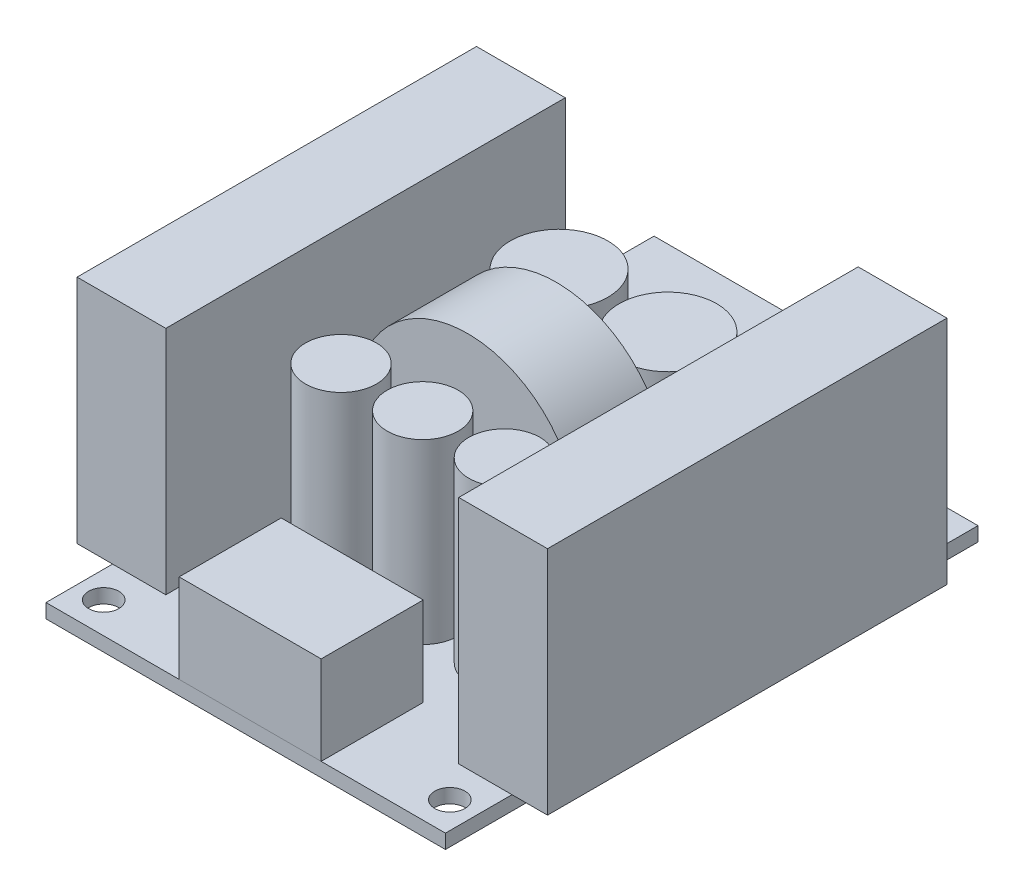
ISO-10303-21;
HEADER;
FILE_DESCRIPTION(('STEP AP214'),'2;1');
FILE_NAME('part.step','',(''),(''),'','','');
FILE_SCHEMA(('AUTOMOTIVE_DESIGN { 1 0 10303 214 1 1 1 1 }'));
ENDSEC;
DATA;
#1=APPLICATION_CONTEXT('core data for automotive mechanical design processes');
#2=APPLICATION_PROTOCOL_DEFINITION('international standard','automotive_design',2000,#1);
#3=PRODUCT_CONTEXT('',#1,'mechanical');
#4=PRODUCT('Part','Part','',(#3));
#5=PRODUCT_RELATED_PRODUCT_CATEGORY('part','',(#4));
#6=PRODUCT_DEFINITION_FORMATION('','',#4);
#7=PRODUCT_DEFINITION_CONTEXT('part definition',#1,'design');
#8=PRODUCT_DEFINITION('design','',#6,#7);
#9=PRODUCT_DEFINITION_SHAPE('','',#8);
#10=(LENGTH_UNIT() NAMED_UNIT(*) SI_UNIT(.MILLI.,.METRE.));
#11=(NAMED_UNIT(*) PLANE_ANGLE_UNIT() SI_UNIT($,.RADIAN.));
#12=(NAMED_UNIT(*) SI_UNIT($,.STERADIAN.) SOLID_ANGLE_UNIT());
#13=UNCERTAINTY_MEASURE_WITH_UNIT(LENGTH_MEASURE(1.E-05),#10,'distance_accuracy_value','');
#14=(GEOMETRIC_REPRESENTATION_CONTEXT(3) GLOBAL_UNCERTAINTY_ASSIGNED_CONTEXT((#13)) GLOBAL_UNIT_ASSIGNED_CONTEXT((#10,
#11,#12)) REPRESENTATION_CONTEXT('',''));
#15=CARTESIAN_POINT('',(0.,0.,0.));
#16=DIRECTION('',(0.,0.,1.));
#17=DIRECTION('',(1.,0.,0.));
#18=AXIS2_PLACEMENT_3D('',#15,#16,#17);
#19=CARTESIAN_POINT('',(9.20490239777416,21.6,10.061105761081));
#20=DIRECTION('',(0.,-1.,0.));
#21=DIRECTION('',(0.,0.,-1.));
#22=AXIS2_PLACEMENT_3D('',#19,#20,#21);
#23=CYLINDRICAL_SURFACE('',#22,4.00000000000001);
#24=CARTESIAN_POINT('',(9.20490239777416,21.6,10.061105761081));
#25=DIRECTION('',(0.,1.,0.));
#26=DIRECTION('',(0.,0.,-1.));
#27=AXIS2_PLACEMENT_3D('',#24,#25,#26);
#28=CIRCLE('',#27,4.00000000000001);
#29=CARTESIAN_POINT('',(9.20490239777416,21.6,6.06110576108103));
#30=VERTEX_POINT('',#29);
#31=EDGE_CURVE('E11',#30,#30,#28,.T.);
#32=ORIENTED_EDGE('',*,*,#31,.F.);
#33=EDGE_LOOP('',(#32));
#34=FACE_BOUND('',#33,.T.);
#35=CARTESIAN_POINT('',(9.20490239777416,1.6,10.061105761081));
#36=DIRECTION('',(0.,1.,0.));
#37=DIRECTION('',(0.,0.,-1.));
#38=AXIS2_PLACEMENT_3D('',#35,#36,#37);
#39=CIRCLE('',#38,4.00000000000001);
#40=CARTESIAN_POINT('',(9.20490239777416,1.6,6.06110576108103));
#41=VERTEX_POINT('',#40);
#42=EDGE_CURVE('E42',#41,#41,#39,.T.);
#43=ORIENTED_EDGE('',*,*,#42,.T.);
#44=EDGE_LOOP('',(#43));
#45=FACE_BOUND('',#44,.T.);
#46=ADVANCED_FACE('F39',(#34,#45),#23,.T.);
#47=CARTESIAN_POINT('',(9.20490239777416,21.6,10.061105761081));
#48=DIRECTION('',(0.,-1.,0.));
#49=DIRECTION('',(0.,0.,-1.));
#50=AXIS2_PLACEMENT_3D('',#47,#48,#49);
#51=PLANE('',#50);
#52=ORIENTED_EDGE('',*,*,#31,.T.);
#53=EDGE_LOOP('',(#52));
#54=FACE_BOUND('',#53,.T.);
#55=ADVANCED_FACE('F54',(#54),#51,.F.);
#56=CARTESIAN_POINT('',(9.20490239777416,1.6,10.061105761081));
#57=DIRECTION('',(0.,-1.,0.));
#58=DIRECTION('',(0.,0.,-1.));
#59=AXIS2_PLACEMENT_3D('',#56,#57,#58);
#60=PLANE('',#59);
#61=ORIENTED_EDGE('',*,*,#42,.F.);
#62=EDGE_LOOP('',(#61));
#63=FACE_BOUND('',#62,.T.);
#64=ADVANCED_FACE('F52',(#63),#60,.T.);
#65=CLOSED_SHELL('',(#46,#55,#64));
#66=MANIFOLD_SOLID_BREP('B2',#65);
#67=CARTESIAN_POINT('',(-9.20490239777416,21.6,10.061105761081));
#68=DIRECTION('',(0.,-1.,0.));
#69=DIRECTION('',(0.,0.,-1.));
#70=AXIS2_PLACEMENT_3D('',#67,#68,#69);
#71=CYLINDRICAL_SURFACE('',#70,4.);
#72=CARTESIAN_POINT('',(-9.20490239777416,21.6,10.061105761081));
#73=DIRECTION('',(0.,1.,0.));
#74=DIRECTION('',(0.,0.,1.));
#75=AXIS2_PLACEMENT_3D('',#72,#73,#74);
#76=CIRCLE('',#75,4.);
#77=CARTESIAN_POINT('',(-9.20490239777416,21.6,14.061105761081));
#78=VERTEX_POINT('',#77);
#79=EDGE_CURVE('E38',#78,#78,#76,.T.);
#80=ORIENTED_EDGE('',*,*,#79,.F.);
#81=EDGE_LOOP('',(#80));
#82=FACE_BOUND('',#81,.T.);
#83=CARTESIAN_POINT('',(-9.20490239777416,1.6,10.061105761081));
#84=DIRECTION('',(0.,1.,0.));
#85=DIRECTION('',(0.,0.,1.));
#86=AXIS2_PLACEMENT_3D('',#83,#84,#85);
#87=CIRCLE('',#86,4.);
#88=CARTESIAN_POINT('',(-9.20490239777416,1.6,14.061105761081));
#89=VERTEX_POINT('',#88);
#90=EDGE_CURVE('E90',#89,#89,#87,.T.);
#91=ORIENTED_EDGE('',*,*,#90,.T.);
#92=EDGE_LOOP('',(#91));
#93=FACE_BOUND('',#92,.T.);
#94=ADVANCED_FACE('F87',(#82,#93),#71,.T.);
#95=CARTESIAN_POINT('',(-9.20490239777416,21.6,10.061105761081));
#96=DIRECTION('',(0.,1.,0.));
#97=DIRECTION('',(0.,0.,1.));
#98=AXIS2_PLACEMENT_3D('',#95,#96,#97);
#99=PLANE('',#98);
#100=ORIENTED_EDGE('',*,*,#79,.T.);
#101=EDGE_LOOP('',(#100));
#102=FACE_BOUND('',#101,.T.);
#103=ADVANCED_FACE('F102',(#102),#99,.T.);
#104=CARTESIAN_POINT('',(-9.20490239777416,1.6,10.061105761081));
#105=DIRECTION('',(0.,1.,0.));
#106=DIRECTION('',(0.,0.,1.));
#107=AXIS2_PLACEMENT_3D('',#104,#105,#106);
#108=PLANE('',#107);
#109=ORIENTED_EDGE('',*,*,#90,.F.);
#110=EDGE_LOOP('',(#109));
#111=FACE_BOUND('',#110,.T.);
#112=ADVANCED_FACE('F100',(#111),#108,.F.);
#113=CLOSED_SHELL('',(#94,#103,#112));
#114=MANIFOLD_SOLID_BREP('B6',#113);
#115=CARTESIAN_POINT('',(0.,21.6,10.061105761081));
#116=DIRECTION('',(0.,-1.,0.));
#117=DIRECTION('',(0.,0.,-1.));
#118=AXIS2_PLACEMENT_3D('',#115,#116,#117);
#119=CYLINDRICAL_SURFACE('',#118,4.);
#120=CARTESIAN_POINT('',(0.,21.6,10.061105761081));
#121=DIRECTION('',(0.,1.,0.));
#122=DIRECTION('',(0.,0.,1.));
#123=AXIS2_PLACEMENT_3D('',#120,#121,#122);
#124=CIRCLE('',#123,4.);
#125=CARTESIAN_POINT('',(0.,21.6,14.061105761081));
#126=VERTEX_POINT('',#125);
#127=EDGE_CURVE('E86',#126,#126,#124,.T.);
#128=ORIENTED_EDGE('',*,*,#127,.F.);
#129=EDGE_LOOP('',(#128));
#130=FACE_BOUND('',#129,.T.);
#131=CARTESIAN_POINT('',(0.,1.6,10.061105761081));
#132=DIRECTION('',(0.,1.,0.));
#133=DIRECTION('',(0.,0.,1.));
#134=AXIS2_PLACEMENT_3D('',#131,#132,#133);
#135=CIRCLE('',#134,4.);
#136=CARTESIAN_POINT('',(0.,1.6,14.061105761081));
#137=VERTEX_POINT('',#136);
#138=EDGE_CURVE('E138',#137,#137,#135,.T.);
#139=ORIENTED_EDGE('',*,*,#138,.T.);
#140=EDGE_LOOP('',(#139));
#141=FACE_BOUND('',#140,.T.);
#142=ADVANCED_FACE('F135',(#130,#141),#119,.T.);
#143=CARTESIAN_POINT('',(0.,21.6,10.061105761081));
#144=DIRECTION('',(0.,1.,0.));
#145=DIRECTION('',(0.,0.,1.));
#146=AXIS2_PLACEMENT_3D('',#143,#144,#145);
#147=PLANE('',#146);
#148=ORIENTED_EDGE('',*,*,#127,.T.);
#149=EDGE_LOOP('',(#148));
#150=FACE_BOUND('',#149,.T.);
#151=ADVANCED_FACE('F150',(#150),#147,.T.);
#152=CARTESIAN_POINT('',(0.,1.6,10.061105761081));
#153=DIRECTION('',(0.,1.,0.));
#154=DIRECTION('',(0.,0.,1.));
#155=AXIS2_PLACEMENT_3D('',#152,#153,#154);
#156=PLANE('',#155);
#157=ORIENTED_EDGE('',*,*,#138,.F.);
#158=EDGE_LOOP('',(#157));
#159=FACE_BOUND('',#158,.T.);
#160=ADVANCED_FACE('F148',(#159),#156,.F.);
#161=CLOSED_SHELL('',(#142,#151,#160));
#162=MANIFOLD_SOLID_BREP('B33',#161);
#163=CARTESIAN_POINT('',(6.13089759294121,21.6,-11.4334985532298));
#164=DIRECTION('',(0.,-1.,0.));
#165=DIRECTION('',(0.,0.,-1.));
#166=AXIS2_PLACEMENT_3D('',#163,#164,#165);
#167=CYLINDRICAL_SURFACE('',#166,5.5);
#168=CARTESIAN_POINT('',(6.13089759294121,21.6,-11.4334985532298));
#169=DIRECTION('',(0.,1.,0.));
#170=DIRECTION('',(0.,0.,-1.));
#171=AXIS2_PLACEMENT_3D('',#168,#169,#170);
#172=CIRCLE('',#171,5.5);
#173=CARTESIAN_POINT('',(6.13089759294121,21.6,-16.9334985532298));
#174=VERTEX_POINT('',#173);
#175=EDGE_CURVE('E134',#174,#174,#172,.T.);
#176=ORIENTED_EDGE('',*,*,#175,.F.);
#177=EDGE_LOOP('',(#176));
#178=FACE_BOUND('',#177,.T.);
#179=CARTESIAN_POINT('',(6.13089759294121,1.6,-11.4334985532298));
#180=DIRECTION('',(0.,1.,0.));
#181=DIRECTION('',(0.,0.,-1.));
#182=AXIS2_PLACEMENT_3D('',#179,#180,#181);
#183=CIRCLE('',#182,5.5);
#184=CARTESIAN_POINT('',(6.13089759294121,1.6,-16.9334985532298));
#185=VERTEX_POINT('',#184);
#186=EDGE_CURVE('E186',#185,#185,#183,.T.);
#187=ORIENTED_EDGE('',*,*,#186,.T.);
#188=EDGE_LOOP('',(#187));
#189=FACE_BOUND('',#188,.T.);
#190=ADVANCED_FACE('F183',(#178,#189),#167,.T.);
#191=CARTESIAN_POINT('',(6.13089759294121,21.6,-11.4334985532298));
#192=DIRECTION('',(0.,-1.,0.));
#193=DIRECTION('',(0.,0.,-1.));
#194=AXIS2_PLACEMENT_3D('',#191,#192,#193);
#195=PLANE('',#194);
#196=ORIENTED_EDGE('',*,*,#175,.T.);
#197=EDGE_LOOP('',(#196));
#198=FACE_BOUND('',#197,.T.);
#199=ADVANCED_FACE('F198',(#198),#195,.F.);
#200=CARTESIAN_POINT('',(6.13089759294121,1.6,-11.4334985532298));
#201=DIRECTION('',(0.,-1.,0.));
#202=DIRECTION('',(0.,0.,-1.));
#203=AXIS2_PLACEMENT_3D('',#200,#201,#202);
#204=PLANE('',#203);
#205=ORIENTED_EDGE('',*,*,#186,.F.);
#206=EDGE_LOOP('',(#205));
#207=FACE_BOUND('',#206,.T.);
#208=ADVANCED_FACE('F196',(#207),#204,.T.);
#209=CLOSED_SHELL('',(#190,#199,#208));
#210=MANIFOLD_SOLID_BREP('B81',#209);
#211=CARTESIAN_POINT('',(-6.13089759294121,21.6,-11.4334985532298));
#212=DIRECTION('',(0.,-1.,0.));
#213=DIRECTION('',(0.,0.,-1.));
#214=AXIS2_PLACEMENT_3D('',#211,#212,#213);
#215=CYLINDRICAL_SURFACE('',#214,5.5);
#216=CARTESIAN_POINT('',(-6.13089759294121,21.6,-11.4334985532298));
#217=DIRECTION('',(0.,1.,0.));
#218=DIRECTION('',(0.,0.,1.));
#219=AXIS2_PLACEMENT_3D('',#216,#217,#218);
#220=CIRCLE('',#219,5.5);
#221=CARTESIAN_POINT('',(-6.13089759294121,21.6,-5.93349855322976));
#222=VERTEX_POINT('',#221);
#223=EDGE_CURVE('E182',#222,#222,#220,.T.);
#224=ORIENTED_EDGE('',*,*,#223,.F.);
#225=EDGE_LOOP('',(#224));
#226=FACE_BOUND('',#225,.T.);
#227=CARTESIAN_POINT('',(-6.13089759294121,1.6,-11.4334985532298));
#228=DIRECTION('',(0.,1.,0.));
#229=DIRECTION('',(0.,0.,1.));
#230=AXIS2_PLACEMENT_3D('',#227,#228,#229);
#231=CIRCLE('',#230,5.5);
#232=CARTESIAN_POINT('',(-6.13089759294121,1.6,-5.93349855322976));
#233=VERTEX_POINT('',#232);
#234=EDGE_CURVE('E234',#233,#233,#231,.T.);
#235=ORIENTED_EDGE('',*,*,#234,.T.);
#236=EDGE_LOOP('',(#235));
#237=FACE_BOUND('',#236,.T.);
#238=ADVANCED_FACE('F231',(#226,#237),#215,.T.);
#239=CARTESIAN_POINT('',(-6.13089759294121,21.6,-11.4334985532298));
#240=DIRECTION('',(0.,1.,0.));
#241=DIRECTION('',(0.,0.,1.));
#242=AXIS2_PLACEMENT_3D('',#239,#240,#241);
#243=PLANE('',#242);
#244=ORIENTED_EDGE('',*,*,#223,.T.);
#245=EDGE_LOOP('',(#244));
#246=FACE_BOUND('',#245,.T.);
#247=ADVANCED_FACE('F246',(#246),#243,.T.);
#248=CARTESIAN_POINT('',(-6.13089759294121,1.6,-11.4334985532298));
#249=DIRECTION('',(0.,1.,0.));
#250=DIRECTION('',(0.,0.,1.));
#251=AXIS2_PLACEMENT_3D('',#248,#249,#250);
#252=PLANE('',#251);
#253=ORIENTED_EDGE('',*,*,#234,.F.);
#254=EDGE_LOOP('',(#253));
#255=FACE_BOUND('',#254,.T.);
#256=ADVANCED_FACE('F244',(#255),#252,.F.);
#257=CLOSED_SHELL('',(#238,#247,#256));
#258=MANIFOLD_SOLID_BREP('B129',#257);
#259=CARTESIAN_POINT('',(0.,14.1,5.));
#260=DIRECTION('',(0.,0.,-1.));
#261=DIRECTION('',(-1.,0.,0.));
#262=AXIS2_PLACEMENT_3D('',#259,#260,#261);
#263=CYLINDRICAL_SURFACE('',#262,12.5);
#264=CARTESIAN_POINT('',(0.,14.1,5.));
#265=DIRECTION('',(0.,0.,1.));
#266=DIRECTION('',(1.,0.,0.));
#267=AXIS2_PLACEMENT_3D('',#264,#265,#266);
#268=CIRCLE('',#267,12.5);
#269=CARTESIAN_POINT('',(12.5,14.1,5.));
#270=VERTEX_POINT('',#269);
#271=EDGE_CURVE('E230',#270,#270,#268,.T.);
#272=ORIENTED_EDGE('',*,*,#271,.F.);
#273=EDGE_LOOP('',(#272));
#274=FACE_BOUND('',#273,.T.);
#275=CARTESIAN_POINT('',(0.,14.1,-5.));
#276=DIRECTION('',(0.,0.,1.));
#277=DIRECTION('',(1.,0.,0.));
#278=AXIS2_PLACEMENT_3D('',#275,#276,#277);
#279=CIRCLE('',#278,12.5);
#280=CARTESIAN_POINT('',(12.5,14.1,-5.));
#281=VERTEX_POINT('',#280);
#282=EDGE_CURVE('E284',#281,#281,#279,.T.);
#283=ORIENTED_EDGE('',*,*,#282,.T.);
#284=EDGE_LOOP('',(#283));
#285=FACE_BOUND('',#284,.T.);
#286=ADVANCED_FACE('F281',(#274,#285),#263,.T.);
#287=CARTESIAN_POINT('',(0.,14.1,5.));
#288=DIRECTION('',(0.,0.,1.));
#289=DIRECTION('',(1.,0.,0.));
#290=AXIS2_PLACEMENT_3D('',#287,#288,#289);
#291=PLANE('',#290);
#292=ORIENTED_EDGE('',*,*,#271,.T.);
#293=EDGE_LOOP('',(#292));
#294=FACE_BOUND('',#293,.T.);
#295=ADVANCED_FACE('F296',(#294),#291,.T.);
#296=CARTESIAN_POINT('',(0.,14.1,-5.));
#297=DIRECTION('',(0.,0.,1.));
#298=DIRECTION('',(1.,0.,0.));
#299=AXIS2_PLACEMENT_3D('',#296,#297,#298);
#300=PLANE('',#299);
#301=ORIENTED_EDGE('',*,*,#282,.F.);
#302=EDGE_LOOP('',(#301));
#303=FACE_BOUND('',#302,.T.);
#304=ADVANCED_FACE('F294',(#303),#300,.F.);
#305=CLOSED_SHELL('',(#286,#295,#304));
#306=MANIFOLD_SOLID_BREP('B177',#305);
#307=CARTESIAN_POINT('',(-14.,11.6,-30.));
#308=DIRECTION('',(1.,0.,0.));
#309=DIRECTION('',(0.,0.,-1.));
#310=AXIS2_PLACEMENT_3D('',#307,#308,#309);
#311=PLANE('',#310);
#312=DIRECTION('',(0.,0.,1.));
#313=VECTOR('',#312,1.);
#314=CARTESIAN_POINT('',(-14.,1.6,-30.));
#315=LINE('',#314,#313);
#316=CARTESIAN_POINT('',(-14.,1.6,-30.));
#317=VERTEX_POINT('',#316);
#318=CARTESIAN_POINT('',(-14.,1.6,-18.5));
#319=VERTEX_POINT('',#318);
#320=EDGE_CURVE('E394',#317,#319,#315,.T.);
#321=ORIENTED_EDGE('',*,*,#320,.T.);
#322=DIRECTION('',(0.,-1.,0.));
#323=VECTOR('',#322,1.);
#324=CARTESIAN_POINT('',(-14.,11.6,-18.5));
#325=LINE('',#324,#323);
#326=CARTESIAN_POINT('',(-14.,11.6,-18.5));
#327=VERTEX_POINT('',#326);
#328=EDGE_CURVE('E279',#327,#319,#325,.T.);
#329=ORIENTED_EDGE('',*,*,#328,.F.);
#330=DIRECTION('',(0.,0.,1.));
#331=VECTOR('',#330,1.);
#332=CARTESIAN_POINT('',(-14.,11.6,-30.));
#333=LINE('',#332,#331);
#334=CARTESIAN_POINT('',(-14.,11.6,-30.));
#335=VERTEX_POINT('',#334);
#336=EDGE_CURVE('E382',#335,#327,#333,.T.);
#337=ORIENTED_EDGE('',*,*,#336,.F.);
#338=DIRECTION('',(0.,-1.,0.));
#339=VECTOR('',#338,1.);
#340=CARTESIAN_POINT('',(-14.,11.6,-30.));
#341=LINE('',#340,#339);
#342=EDGE_CURVE('E390',#335,#317,#341,.T.);
#343=ORIENTED_EDGE('',*,*,#342,.T.);
#344=EDGE_LOOP('',(#321,#329,#337,#343));
#345=FACE_BOUND('',#344,.T.);
#346=ADVANCED_FACE('F331',(#345),#311,.F.);
#347=CARTESIAN_POINT('',(-14.,11.6,-18.5));
#348=DIRECTION('',(0.,0.,-1.));
#349=DIRECTION('',(-1.,0.,0.));
#350=AXIS2_PLACEMENT_3D('',#347,#348,#349);
#351=PLANE('',#350);
#352=DIRECTION('',(1.,0.,0.));
#353=VECTOR('',#352,1.);
#354=CARTESIAN_POINT('',(-14.,1.6,-18.5));
#355=LINE('',#354,#353);
#356=CARTESIAN_POINT('',(2.,1.6,-18.5));
#357=VERTEX_POINT('',#356);
#358=EDGE_CURVE('E386',#319,#357,#355,.T.);
#359=ORIENTED_EDGE('',*,*,#358,.T.);
#360=DIRECTION('',(0.,-1.,0.));
#361=VECTOR('',#360,1.);
#362=CARTESIAN_POINT('',(2.,11.6,-18.5));
#363=LINE('',#362,#361);
#364=CARTESIAN_POINT('',(2.,11.6,-18.5));
#365=VERTEX_POINT('',#364);
#366=EDGE_CURVE('E339',#365,#357,#363,.T.);
#367=ORIENTED_EDGE('',*,*,#366,.F.);
#368=DIRECTION('',(1.,0.,0.));
#369=VECTOR('',#368,1.);
#370=CARTESIAN_POINT('',(-14.,11.6,-18.5));
#371=LINE('',#370,#369);
#372=EDGE_CURVE('E377',#327,#365,#371,.T.);
#373=ORIENTED_EDGE('',*,*,#372,.F.);
#374=ORIENTED_EDGE('',*,*,#328,.T.);
#375=EDGE_LOOP('',(#359,#367,#373,#374));
#376=FACE_BOUND('',#375,.T.);
#377=ADVANCED_FACE('F385',(#376),#351,.F.);
#378=CARTESIAN_POINT('',(2.,11.6,-30.));
#379=DIRECTION('',(-1.,0.,0.));
#380=DIRECTION('',(0.,0.,1.));
#381=AXIS2_PLACEMENT_3D('',#378,#379,#380);
#382=PLANE('',#381);
#383=DIRECTION('',(0.,0.,-1.));
#384=VECTOR('',#383,1.);
#385=CARTESIAN_POINT('',(2.,1.6,-30.));
#386=LINE('',#385,#384);
#387=CARTESIAN_POINT('',(2.,1.6,-30.));
#388=VERTEX_POINT('',#387);
#389=EDGE_CURVE('E364',#357,#388,#386,.T.);
#390=ORIENTED_EDGE('',*,*,#389,.T.);
#391=DIRECTION('',(0.,-1.,0.));
#392=VECTOR('',#391,1.);
#393=CARTESIAN_POINT('',(2.,11.6,-30.));
#394=LINE('',#393,#392);
#395=CARTESIAN_POINT('',(2.,11.6,-30.));
#396=VERTEX_POINT('',#395);
#397=EDGE_CURVE('E387',#396,#388,#394,.T.);
#398=ORIENTED_EDGE('',*,*,#397,.F.);
#399=DIRECTION('',(0.,0.,-1.));
#400=VECTOR('',#399,1.);
#401=CARTESIAN_POINT('',(2.,11.6,-30.));
#402=LINE('',#401,#400);
#403=EDGE_CURVE('E380',#365,#396,#402,.T.);
#404=ORIENTED_EDGE('',*,*,#403,.F.);
#405=ORIENTED_EDGE('',*,*,#366,.T.);
#406=EDGE_LOOP('',(#390,#398,#404,#405));
#407=FACE_BOUND('',#406,.T.);
#408=ADVANCED_FACE('F388',(#407),#382,.F.);
#409=CARTESIAN_POINT('',(-14.,11.6,-30.));
#410=DIRECTION('',(0.,0.,1.));
#411=DIRECTION('',(1.,0.,0.));
#412=AXIS2_PLACEMENT_3D('',#409,#410,#411);
#413=PLANE('',#412);
#414=DIRECTION('',(-1.,0.,0.));
#415=VECTOR('',#414,1.);
#416=CARTESIAN_POINT('',(-14.,1.6,-30.));
#417=LINE('',#416,#415);
#418=EDGE_CURVE('E370',#388,#317,#417,.T.);
#419=ORIENTED_EDGE('',*,*,#418,.T.);
#420=ORIENTED_EDGE('',*,*,#342,.F.);
#421=DIRECTION('',(-1.,0.,0.));
#422=VECTOR('',#421,1.);
#423=CARTESIAN_POINT('',(-14.,11.6,-30.));
#424=LINE('',#423,#422);
#425=EDGE_CURVE('E347',#396,#335,#424,.T.);
#426=ORIENTED_EDGE('',*,*,#425,.F.);
#427=ORIENTED_EDGE('',*,*,#397,.T.);
#428=EDGE_LOOP('',(#419,#420,#426,#427));
#429=FACE_BOUND('',#428,.T.);
#430=ADVANCED_FACE('F401',(#429),#413,.F.);
#431=CARTESIAN_POINT('',(0.,11.6,0.));
#432=DIRECTION('',(0.,1.,0.));
#433=DIRECTION('',(0.,0.,1.));
#434=AXIS2_PLACEMENT_3D('',#431,#432,#433);
#435=PLANE('',#434);
#436=ORIENTED_EDGE('',*,*,#336,.T.);
#437=ORIENTED_EDGE('',*,*,#372,.T.);
#438=ORIENTED_EDGE('',*,*,#403,.T.);
#439=ORIENTED_EDGE('',*,*,#425,.T.);
#440=EDGE_LOOP('',(#436,#437,#438,#439));
#441=FACE_BOUND('',#440,.T.);
#442=ADVANCED_FACE('F378',(#441),#435,.T.);
#443=CARTESIAN_POINT('',(0.,1.6,0.));
#444=DIRECTION('',(0.,1.,0.));
#445=DIRECTION('',(0.,0.,1.));
#446=AXIS2_PLACEMENT_3D('',#443,#444,#445);
#447=PLANE('',#446);
#448=ORIENTED_EDGE('',*,*,#320,.F.);
#449=ORIENTED_EDGE('',*,*,#418,.F.);
#450=ORIENTED_EDGE('',*,*,#389,.F.);
#451=ORIENTED_EDGE('',*,*,#358,.F.);
#452=EDGE_LOOP('',(#448,#449,#450,#451));
#453=FACE_BOUND('',#452,.T.);
#454=ADVANCED_FACE('F404',(#453),#447,.F.);
#455=CLOSED_SHELL('',(#346,#377,#408,#430,#442,#454));
#456=MANIFOLD_SOLID_BREP('B225',#455);
#457=CARTESIAN_POINT('',(8.5,11.6,30.));
#458=DIRECTION('',(-1.,0.,0.));
#459=DIRECTION('',(0.,0.,1.));
#460=AXIS2_PLACEMENT_3D('',#457,#458,#459);
#461=PLANE('',#460);
#462=DIRECTION('',(0.,0.,-1.));
#463=VECTOR('',#462,1.);
#464=CARTESIAN_POINT('',(8.5,1.6,30.));
#465=LINE('',#464,#463);
#466=CARTESIAN_POINT('',(8.5,1.6,30.));
#467=VERTEX_POINT('',#466);
#468=CARTESIAN_POINT('',(8.5,1.6,18.5));
#469=VERTEX_POINT('',#468);
#470=EDGE_CURVE('E527',#467,#469,#465,.T.);
#471=ORIENTED_EDGE('',*,*,#470,.T.);
#472=DIRECTION('',(0.,-1.,0.));
#473=VECTOR('',#472,1.);
#474=CARTESIAN_POINT('',(8.5,11.6,18.5));
#475=LINE('',#474,#473);
#476=CARTESIAN_POINT('',(8.5,11.6,18.5));
#477=VERTEX_POINT('',#476);
#478=EDGE_CURVE('E329',#477,#469,#475,.T.);
#479=ORIENTED_EDGE('',*,*,#478,.F.);
#480=DIRECTION('',(0.,0.,-1.));
#481=VECTOR('',#480,1.);
#482=CARTESIAN_POINT('',(8.5,11.6,30.));
#483=LINE('',#482,#481);
#484=CARTESIAN_POINT('',(8.5,11.6,30.));
#485=VERTEX_POINT('',#484);
#486=EDGE_CURVE('E515',#485,#477,#483,.T.);
#487=ORIENTED_EDGE('',*,*,#486,.F.);
#488=DIRECTION('',(0.,-1.,0.));
#489=VECTOR('',#488,1.);
#490=CARTESIAN_POINT('',(8.5,11.6,30.));
#491=LINE('',#490,#489);
#492=EDGE_CURVE('E523',#485,#467,#491,.T.);
#493=ORIENTED_EDGE('',*,*,#492,.T.);
#494=EDGE_LOOP('',(#471,#479,#487,#493));
#495=FACE_BOUND('',#494,.T.);
#496=ADVANCED_FACE('F464',(#495),#461,.F.);
#497=CARTESIAN_POINT('',(8.5,11.6,18.5));
#498=DIRECTION('',(0.,0.,1.));
#499=DIRECTION('',(1.,0.,0.));
#500=AXIS2_PLACEMENT_3D('',#497,#498,#499);
#501=PLANE('',#500);
#502=DIRECTION('',(-1.,0.,0.));
#503=VECTOR('',#502,1.);
#504=CARTESIAN_POINT('',(8.5,1.6,18.5));
#505=LINE('',#504,#503);
#506=CARTESIAN_POINT('',(-7.5,1.6,18.5));
#507=VERTEX_POINT('',#506);
#508=EDGE_CURVE('E519',#469,#507,#505,.T.);
#509=ORIENTED_EDGE('',*,*,#508,.T.);
#510=DIRECTION('',(0.,-1.,0.));
#511=VECTOR('',#510,1.);
#512=CARTESIAN_POINT('',(-7.5,11.6,18.5));
#513=LINE('',#512,#511);
#514=CARTESIAN_POINT('',(-7.5,11.6,18.5));
#515=VERTEX_POINT('',#514);
#516=EDGE_CURVE('E472',#515,#507,#513,.T.);
#517=ORIENTED_EDGE('',*,*,#516,.F.);
#518=DIRECTION('',(-1.,0.,0.));
#519=VECTOR('',#518,1.);
#520=CARTESIAN_POINT('',(8.5,11.6,18.5));
#521=LINE('',#520,#519);
#522=EDGE_CURVE('E510',#477,#515,#521,.T.);
#523=ORIENTED_EDGE('',*,*,#522,.F.);
#524=ORIENTED_EDGE('',*,*,#478,.T.);
#525=EDGE_LOOP('',(#509,#517,#523,#524));
#526=FACE_BOUND('',#525,.T.);
#527=ADVANCED_FACE('F518',(#526),#501,.F.);
#528=CARTESIAN_POINT('',(-7.5,11.6,30.));
#529=DIRECTION('',(1.,0.,0.));
#530=DIRECTION('',(0.,0.,-1.));
#531=AXIS2_PLACEMENT_3D('',#528,#529,#530);
#532=PLANE('',#531);
#533=DIRECTION('',(0.,0.,1.));
#534=VECTOR('',#533,1.);
#535=CARTESIAN_POINT('',(-7.5,1.6,30.));
#536=LINE('',#535,#534);
#537=CARTESIAN_POINT('',(-7.5,1.6,30.));
#538=VERTEX_POINT('',#537);
#539=EDGE_CURVE('E497',#507,#538,#536,.T.);
#540=ORIENTED_EDGE('',*,*,#539,.T.);
#541=DIRECTION('',(0.,-1.,0.));
#542=VECTOR('',#541,1.);
#543=CARTESIAN_POINT('',(-7.5,11.6,30.));
#544=LINE('',#543,#542);
#545=CARTESIAN_POINT('',(-7.5,11.6,30.));
#546=VERTEX_POINT('',#545);
#547=EDGE_CURVE('E520',#546,#538,#544,.T.);
#548=ORIENTED_EDGE('',*,*,#547,.F.);
#549=DIRECTION('',(0.,0.,1.));
#550=VECTOR('',#549,1.);
#551=CARTESIAN_POINT('',(-7.5,11.6,30.));
#552=LINE('',#551,#550);
#553=EDGE_CURVE('E513',#515,#546,#552,.T.);
#554=ORIENTED_EDGE('',*,*,#553,.F.);
#555=ORIENTED_EDGE('',*,*,#516,.T.);
#556=EDGE_LOOP('',(#540,#548,#554,#555));
#557=FACE_BOUND('',#556,.T.);
#558=ADVANCED_FACE('F521',(#557),#532,.F.);
#559=CARTESIAN_POINT('',(8.5,11.6,30.));
#560=DIRECTION('',(0.,0.,-1.));
#561=DIRECTION('',(-1.,0.,0.));
#562=AXIS2_PLACEMENT_3D('',#559,#560,#561);
#563=PLANE('',#562);
#564=DIRECTION('',(1.,0.,0.));
#565=VECTOR('',#564,1.);
#566=CARTESIAN_POINT('',(8.5,1.6,30.));
#567=LINE('',#566,#565);
#568=EDGE_CURVE('E503',#538,#467,#567,.T.);
#569=ORIENTED_EDGE('',*,*,#568,.T.);
#570=ORIENTED_EDGE('',*,*,#492,.F.);
#571=DIRECTION('',(1.,0.,0.));
#572=VECTOR('',#571,1.);
#573=CARTESIAN_POINT('',(8.5,11.6,30.));
#574=LINE('',#573,#572);
#575=EDGE_CURVE('E480',#546,#485,#574,.T.);
#576=ORIENTED_EDGE('',*,*,#575,.F.);
#577=ORIENTED_EDGE('',*,*,#547,.T.);
#578=EDGE_LOOP('',(#569,#570,#576,#577));
#579=FACE_BOUND('',#578,.T.);
#580=ADVANCED_FACE('F534',(#579),#563,.F.);
#581=CARTESIAN_POINT('',(0.,11.6,0.));
#582=DIRECTION('',(0.,1.,0.));
#583=DIRECTION('',(0.,0.,1.));
#584=AXIS2_PLACEMENT_3D('',#581,#582,#583);
#585=PLANE('',#584);
#586=ORIENTED_EDGE('',*,*,#486,.T.);
#587=ORIENTED_EDGE('',*,*,#522,.T.);
#588=ORIENTED_EDGE('',*,*,#553,.T.);
#589=ORIENTED_EDGE('',*,*,#575,.T.);
#590=EDGE_LOOP('',(#586,#587,#588,#589));
#591=FACE_BOUND('',#590,.T.);
#592=ADVANCED_FACE('F511',(#591),#585,.T.);
#593=CARTESIAN_POINT('',(0.,1.6,0.));
#594=DIRECTION('',(0.,1.,0.));
#595=DIRECTION('',(0.,0.,1.));
#596=AXIS2_PLACEMENT_3D('',#593,#594,#595);
#597=PLANE('',#596);
#598=ORIENTED_EDGE('',*,*,#470,.F.);
#599=ORIENTED_EDGE('',*,*,#568,.F.);
#600=ORIENTED_EDGE('',*,*,#539,.F.);
#601=ORIENTED_EDGE('',*,*,#508,.F.);
#602=EDGE_LOOP('',(#598,#599,#600,#601));
#603=FACE_BOUND('',#602,.T.);
#604=ADVANCED_FACE('F537',(#603),#597,.F.);
#605=CLOSED_SHELL('',(#496,#527,#558,#580,#592,#604));
#606=MANIFOLD_SOLID_BREP('B273',#605);
#607=CARTESIAN_POINT('',(26.5,27.6,-22.5));
#608=DIRECTION('',(0.,0.,1.));
#609=DIRECTION('',(1.,0.,0.));
#610=AXIS2_PLACEMENT_3D('',#607,#608,#609);
#611=PLANE('',#610);
#612=DIRECTION('',(-1.,0.,0.));
#613=VECTOR('',#612,1.);
#614=CARTESIAN_POINT('',(26.5,1.6,-22.5));
#615=LINE('',#614,#613);
#616=CARTESIAN_POINT('',(26.5,1.6,-22.5));
#617=VERTEX_POINT('',#616);
#618=CARTESIAN_POINT('',(16.5,1.6,-22.5));
#619=VERTEX_POINT('',#618);
#620=EDGE_CURVE('E660',#617,#619,#615,.T.);
#621=ORIENTED_EDGE('',*,*,#620,.T.);
#622=DIRECTION('',(0.,-1.,0.));
#623=VECTOR('',#622,1.);
#624=CARTESIAN_POINT('',(16.5,27.6,-22.5));
#625=LINE('',#624,#623);
#626=CARTESIAN_POINT('',(16.5,27.6,-22.5));
#627=VERTEX_POINT('',#626);
#628=EDGE_CURVE('E462',#627,#619,#625,.T.);
#629=ORIENTED_EDGE('',*,*,#628,.F.);
#630=DIRECTION('',(-1.,0.,0.));
#631=VECTOR('',#630,1.);
#632=CARTESIAN_POINT('',(26.5,27.6,-22.5));
#633=LINE('',#632,#631);
#634=CARTESIAN_POINT('',(26.5,27.6,-22.5));
#635=VERTEX_POINT('',#634);
#636=EDGE_CURVE('E648',#635,#627,#633,.T.);
#637=ORIENTED_EDGE('',*,*,#636,.F.);
#638=DIRECTION('',(0.,-1.,0.));
#639=VECTOR('',#638,1.);
#640=CARTESIAN_POINT('',(26.5,27.6,-22.5));
#641=LINE('',#640,#639);
#642=EDGE_CURVE('E656',#635,#617,#641,.T.);
#643=ORIENTED_EDGE('',*,*,#642,.T.);
#644=EDGE_LOOP('',(#621,#629,#637,#643));
#645=FACE_BOUND('',#644,.T.);
#646=ADVANCED_FACE('F597',(#645),#611,.F.);
#647=CARTESIAN_POINT('',(16.5,27.6,-22.5));
#648=DIRECTION('',(1.,0.,0.));
#649=DIRECTION('',(0.,0.,-1.));
#650=AXIS2_PLACEMENT_3D('',#647,#648,#649);
#651=PLANE('',#650);
#652=DIRECTION('',(0.,0.,1.));
#653=VECTOR('',#652,1.);
#654=CARTESIAN_POINT('',(16.5,1.6,-22.5));
#655=LINE('',#654,#653);
#656=CARTESIAN_POINT('',(16.5,1.6,22.5));
#657=VERTEX_POINT('',#656);
#658=EDGE_CURVE('E652',#619,#657,#655,.T.);
#659=ORIENTED_EDGE('',*,*,#658,.T.);
#660=DIRECTION('',(0.,-1.,0.));
#661=VECTOR('',#660,1.);
#662=CARTESIAN_POINT('',(16.5,27.6,22.5));
#663=LINE('',#662,#661);
#664=CARTESIAN_POINT('',(16.5,27.6,22.5));
#665=VERTEX_POINT('',#664);
#666=EDGE_CURVE('E605',#665,#657,#663,.T.);
#667=ORIENTED_EDGE('',*,*,#666,.F.);
#668=DIRECTION('',(0.,0.,1.));
#669=VECTOR('',#668,1.);
#670=CARTESIAN_POINT('',(16.5,27.6,-22.5));
#671=LINE('',#670,#669);
#672=EDGE_CURVE('E643',#627,#665,#671,.T.);
#673=ORIENTED_EDGE('',*,*,#672,.F.);
#674=ORIENTED_EDGE('',*,*,#628,.T.);
#675=EDGE_LOOP('',(#659,#667,#673,#674));
#676=FACE_BOUND('',#675,.T.);
#677=ADVANCED_FACE('F651',(#676),#651,.F.);
#678=CARTESIAN_POINT('',(26.5,27.6,22.5));
#679=DIRECTION('',(0.,0.,-1.));
#680=DIRECTION('',(-1.,0.,0.));
#681=AXIS2_PLACEMENT_3D('',#678,#679,#680);
#682=PLANE('',#681);
#683=DIRECTION('',(1.,0.,0.));
#684=VECTOR('',#683,1.);
#685=CARTESIAN_POINT('',(26.5,1.6,22.5));
#686=LINE('',#685,#684);
#687=CARTESIAN_POINT('',(26.5,1.6,22.5));
#688=VERTEX_POINT('',#687);
#689=EDGE_CURVE('E630',#657,#688,#686,.T.);
#690=ORIENTED_EDGE('',*,*,#689,.T.);
#691=DIRECTION('',(0.,-1.,0.));
#692=VECTOR('',#691,1.);
#693=CARTESIAN_POINT('',(26.5,27.6,22.5));
#694=LINE('',#693,#692);
#695=CARTESIAN_POINT('',(26.5,27.6,22.5));
#696=VERTEX_POINT('',#695);
#697=EDGE_CURVE('E653',#696,#688,#694,.T.);
#698=ORIENTED_EDGE('',*,*,#697,.F.);
#699=DIRECTION('',(1.,0.,0.));
#700=VECTOR('',#699,1.);
#701=CARTESIAN_POINT('',(26.5,27.6,22.5));
#702=LINE('',#701,#700);
#703=EDGE_CURVE('E646',#665,#696,#702,.T.);
#704=ORIENTED_EDGE('',*,*,#703,.F.);
#705=ORIENTED_EDGE('',*,*,#666,.T.);
#706=EDGE_LOOP('',(#690,#698,#704,#705));
#707=FACE_BOUND('',#706,.T.);
#708=ADVANCED_FACE('F654',(#707),#682,.F.);
#709=CARTESIAN_POINT('',(26.5,27.6,-22.5));
#710=DIRECTION('',(-1.,0.,0.));
#711=DIRECTION('',(0.,0.,1.));
#712=AXIS2_PLACEMENT_3D('',#709,#710,#711);
#713=PLANE('',#712);
#714=DIRECTION('',(0.,0.,-1.));
#715=VECTOR('',#714,1.);
#716=CARTESIAN_POINT('',(26.5,1.6,-22.5));
#717=LINE('',#716,#715);
#718=EDGE_CURVE('E636',#688,#617,#717,.T.);
#719=ORIENTED_EDGE('',*,*,#718,.T.);
#720=ORIENTED_EDGE('',*,*,#642,.F.);
#721=DIRECTION('',(0.,0.,-1.));
#722=VECTOR('',#721,1.);
#723=CARTESIAN_POINT('',(26.5,27.6,-22.5));
#724=LINE('',#723,#722);
#725=EDGE_CURVE('E613',#696,#635,#724,.T.);
#726=ORIENTED_EDGE('',*,*,#725,.F.);
#727=ORIENTED_EDGE('',*,*,#697,.T.);
#728=EDGE_LOOP('',(#719,#720,#726,#727));
#729=FACE_BOUND('',#728,.T.);
#730=ADVANCED_FACE('F667',(#729),#713,.F.);
#731=CARTESIAN_POINT('',(0.,27.6,0.));
#732=DIRECTION('',(0.,1.,0.));
#733=DIRECTION('',(0.,0.,1.));
#734=AXIS2_PLACEMENT_3D('',#731,#732,#733);
#735=PLANE('',#734);
#736=ORIENTED_EDGE('',*,*,#636,.T.);
#737=ORIENTED_EDGE('',*,*,#672,.T.);
#738=ORIENTED_EDGE('',*,*,#703,.T.);
#739=ORIENTED_EDGE('',*,*,#725,.T.);
#740=EDGE_LOOP('',(#736,#737,#738,#739));
#741=FACE_BOUND('',#740,.T.);
#742=ADVANCED_FACE('F644',(#741),#735,.T.);
#743=CARTESIAN_POINT('',(0.,1.6,0.));
#744=DIRECTION('',(0.,1.,0.));
#745=DIRECTION('',(0.,0.,1.));
#746=AXIS2_PLACEMENT_3D('',#743,#744,#745);
#747=PLANE('',#746);
#748=ORIENTED_EDGE('',*,*,#620,.F.);
#749=ORIENTED_EDGE('',*,*,#718,.F.);
#750=ORIENTED_EDGE('',*,*,#689,.F.);
#751=ORIENTED_EDGE('',*,*,#658,.F.);
#752=EDGE_LOOP('',(#748,#749,#750,#751));
#753=FACE_BOUND('',#752,.T.);
#754=ADVANCED_FACE('F670',(#753),#747,.F.);
#755=CLOSED_SHELL('',(#646,#677,#708,#730,#742,#754));
#756=MANIFOLD_SOLID_BREP('B323',#755);
#757=CARTESIAN_POINT('',(-26.5,27.6,-22.5));
#758=DIRECTION('',(1.,0.,0.));
#759=DIRECTION('',(0.,0.,-1.));
#760=AXIS2_PLACEMENT_3D('',#757,#758,#759);
#761=PLANE('',#760);
#762=DIRECTION('',(0.,0.,1.));
#763=VECTOR('',#762,1.);
#764=CARTESIAN_POINT('',(-26.5,1.6,-22.5));
#765=LINE('',#764,#763);
#766=CARTESIAN_POINT('',(-26.5,1.6,-22.5));
#767=VERTEX_POINT('',#766);
#768=CARTESIAN_POINT('',(-26.5,1.6,22.5));
#769=VERTEX_POINT('',#768);
#770=EDGE_CURVE('E792',#767,#769,#765,.T.);
#771=ORIENTED_EDGE('',*,*,#770,.T.);
#772=DIRECTION('',(0.,-1.,0.));
#773=VECTOR('',#772,1.);
#774=CARTESIAN_POINT('',(-26.5,27.6,22.5));
#775=LINE('',#774,#773);
#776=CARTESIAN_POINT('',(-26.5,27.6,22.5));
#777=VERTEX_POINT('',#776);
#778=EDGE_CURVE('E595',#777,#769,#775,.T.);
#779=ORIENTED_EDGE('',*,*,#778,.F.);
#780=DIRECTION('',(0.,0.,1.));
#781=VECTOR('',#780,1.);
#782=CARTESIAN_POINT('',(-26.5,27.6,-22.5));
#783=LINE('',#782,#781);
#784=CARTESIAN_POINT('',(-26.5,27.6,-22.5));
#785=VERTEX_POINT('',#784);
#786=EDGE_CURVE('E780',#785,#777,#783,.T.);
#787=ORIENTED_EDGE('',*,*,#786,.F.);
#788=DIRECTION('',(0.,-1.,0.));
#789=VECTOR('',#788,1.);
#790=CARTESIAN_POINT('',(-26.5,27.6,-22.5));
#791=LINE('',#790,#789);
#792=EDGE_CURVE('E788',#785,#767,#791,.T.);
#793=ORIENTED_EDGE('',*,*,#792,.T.);
#794=EDGE_LOOP('',(#771,#779,#787,#793));
#795=FACE_BOUND('',#794,.T.);
#796=ADVANCED_FACE('F729',(#795),#761,.F.);
#797=CARTESIAN_POINT('',(-26.5,27.6,22.5));
#798=DIRECTION('',(0.,0.,-1.));
#799=DIRECTION('',(-1.,0.,0.));
#800=AXIS2_PLACEMENT_3D('',#797,#798,#799);
#801=PLANE('',#800);
#802=DIRECTION('',(1.,0.,0.));
#803=VECTOR('',#802,1.);
#804=CARTESIAN_POINT('',(-26.5,1.6,22.5));
#805=LINE('',#804,#803);
#806=CARTESIAN_POINT('',(-16.5,1.6,22.5));
#807=VERTEX_POINT('',#806);
#808=EDGE_CURVE('E784',#769,#807,#805,.T.);
#809=ORIENTED_EDGE('',*,*,#808,.T.);
#810=DIRECTION('',(0.,-1.,0.));
#811=VECTOR('',#810,1.);
#812=CARTESIAN_POINT('',(-16.5,27.6,22.5));
#813=LINE('',#812,#811);
#814=CARTESIAN_POINT('',(-16.5,27.6,22.5));
#815=VERTEX_POINT('',#814);
#816=EDGE_CURVE('E737',#815,#807,#813,.T.);
#817=ORIENTED_EDGE('',*,*,#816,.F.);
#818=DIRECTION('',(1.,0.,0.));
#819=VECTOR('',#818,1.);
#820=CARTESIAN_POINT('',(-26.5,27.6,22.5));
#821=LINE('',#820,#819);
#822=EDGE_CURVE('E775',#777,#815,#821,.T.);
#823=ORIENTED_EDGE('',*,*,#822,.F.);
#824=ORIENTED_EDGE('',*,*,#778,.T.);
#825=EDGE_LOOP('',(#809,#817,#823,#824));
#826=FACE_BOUND('',#825,.T.);
#827=ADVANCED_FACE('F783',(#826),#801,.F.);
#828=CARTESIAN_POINT('',(-16.5,27.6,-22.5));
#829=DIRECTION('',(-1.,0.,0.));
#830=DIRECTION('',(0.,0.,1.));
#831=AXIS2_PLACEMENT_3D('',#828,#829,#830);
#832=PLANE('',#831);
#833=DIRECTION('',(0.,0.,-1.));
#834=VECTOR('',#833,1.);
#835=CARTESIAN_POINT('',(-16.5,1.6,-22.5));
#836=LINE('',#835,#834);
#837=CARTESIAN_POINT('',(-16.5,1.6,-22.5));
#838=VERTEX_POINT('',#837);
#839=EDGE_CURVE('E762',#807,#838,#836,.T.);
#840=ORIENTED_EDGE('',*,*,#839,.T.);
#841=DIRECTION('',(0.,-1.,0.));
#842=VECTOR('',#841,1.);
#843=CARTESIAN_POINT('',(-16.5,27.6,-22.5));
#844=LINE('',#843,#842);
#845=CARTESIAN_POINT('',(-16.5,27.6,-22.5));
#846=VERTEX_POINT('',#845);
#847=EDGE_CURVE('E785',#846,#838,#844,.T.);
#848=ORIENTED_EDGE('',*,*,#847,.F.);
#849=DIRECTION('',(0.,0.,-1.));
#850=VECTOR('',#849,1.);
#851=CARTESIAN_POINT('',(-16.5,27.6,-22.5));
#852=LINE('',#851,#850);
#853=EDGE_CURVE('E778',#815,#846,#852,.T.);
#854=ORIENTED_EDGE('',*,*,#853,.F.);
#855=ORIENTED_EDGE('',*,*,#816,.T.);
#856=EDGE_LOOP('',(#840,#848,#854,#855));
#857=FACE_BOUND('',#856,.T.);
#858=ADVANCED_FACE('F786',(#857),#832,.F.);
#859=CARTESIAN_POINT('',(-26.5,27.6,-22.5));
#860=DIRECTION('',(0.,0.,1.));
#861=DIRECTION('',(1.,0.,0.));
#862=AXIS2_PLACEMENT_3D('',#859,#860,#861);
#863=PLANE('',#862);
#864=DIRECTION('',(-1.,0.,0.));
#865=VECTOR('',#864,1.);
#866=CARTESIAN_POINT('',(-26.5,1.6,-22.5));
#867=LINE('',#866,#865);
#868=EDGE_CURVE('E768',#838,#767,#867,.T.);
#869=ORIENTED_EDGE('',*,*,#868,.T.);
#870=ORIENTED_EDGE('',*,*,#792,.F.);
#871=DIRECTION('',(-1.,0.,0.));
#872=VECTOR('',#871,1.);
#873=CARTESIAN_POINT('',(-26.5,27.6,-22.5));
#874=LINE('',#873,#872);
#875=EDGE_CURVE('E745',#846,#785,#874,.T.);
#876=ORIENTED_EDGE('',*,*,#875,.F.);
#877=ORIENTED_EDGE('',*,*,#847,.T.);
#878=EDGE_LOOP('',(#869,#870,#876,#877));
#879=FACE_BOUND('',#878,.T.);
#880=ADVANCED_FACE('F799',(#879),#863,.F.);
#881=CARTESIAN_POINT('',(0.,27.6,0.));
#882=DIRECTION('',(0.,1.,0.));
#883=DIRECTION('',(0.,0.,1.));
#884=AXIS2_PLACEMENT_3D('',#881,#882,#883);
#885=PLANE('',#884);
#886=ORIENTED_EDGE('',*,*,#786,.T.);
#887=ORIENTED_EDGE('',*,*,#822,.T.);
#888=ORIENTED_EDGE('',*,*,#853,.T.);
#889=ORIENTED_EDGE('',*,*,#875,.T.);
#890=EDGE_LOOP('',(#886,#887,#888,#889));
#891=FACE_BOUND('',#890,.T.);
#892=ADVANCED_FACE('F776',(#891),#885,.T.);
#893=CARTESIAN_POINT('',(0.,1.6,0.));
#894=DIRECTION('',(0.,1.,0.));
#895=DIRECTION('',(0.,0.,1.));
#896=AXIS2_PLACEMENT_3D('',#893,#894,#895);
#897=PLANE('',#896);
#898=ORIENTED_EDGE('',*,*,#770,.F.);
#899=ORIENTED_EDGE('',*,*,#868,.F.);
#900=ORIENTED_EDGE('',*,*,#839,.F.);
#901=ORIENTED_EDGE('',*,*,#808,.F.);
#902=EDGE_LOOP('',(#898,#899,#900,#901));
#903=FACE_BOUND('',#902,.T.);
#904=ADVANCED_FACE('F802',(#903),#897,.F.);
#905=CLOSED_SHELL('',(#796,#827,#858,#880,#892,#904));
#906=MANIFOLD_SOLID_BREP('B456',#905);
#907=CARTESIAN_POINT('',(0.,0.,0.));
#908=DIRECTION('',(0.,-1.,0.));
#909=DIRECTION('',(0.,0.,-1.));
#910=AXIS2_PLACEMENT_3D('',#907,#908,#909);
#911=PLANE('',#910);
#912=CARTESIAN_POINT('',(-19.5,0.,-26.5));
#913=DIRECTION('',(0.,1.,0.));
#914=DIRECTION('',(0.,0.,1.));
#915=AXIS2_PLACEMENT_3D('',#912,#913,#914);
#916=CIRCLE('',#915,1.7);
#917=CARTESIAN_POINT('',(-19.5,0.,-24.8));
#918=VERTEX_POINT('',#917);
#919=EDGE_CURVE('E947',#918,#918,#916,.T.);
#920=ORIENTED_EDGE('',*,*,#919,.T.);
#921=EDGE_LOOP('',(#920));
#922=FACE_BOUND('',#921,.T.);
#923=CARTESIAN_POINT('',(-19.5,0.,26.5));
#924=DIRECTION('',(0.,1.,0.));
#925=DIRECTION('',(0.,0.,1.));
#926=AXIS2_PLACEMENT_3D('',#923,#924,#925);
#927=CIRCLE('',#926,1.7);
#928=CARTESIAN_POINT('',(-19.5,0.,28.2));
#929=VERTEX_POINT('',#928);
#930=EDGE_CURVE('E941',#929,#929,#927,.T.);
#931=ORIENTED_EDGE('',*,*,#930,.T.);
#932=EDGE_LOOP('',(#931));
#933=FACE_BOUND('',#932,.T.);
#934=DIRECTION('',(0.,0.,1.));
#935=VECTOR('',#934,1.);
#936=CARTESIAN_POINT('',(-22.5,0.,30.));
#937=LINE('',#936,#935);
#938=CARTESIAN_POINT('',(-22.5,0.,-30.));
#939=VERTEX_POINT('',#938);
#940=CARTESIAN_POINT('',(-22.5,0.,30.));
#941=VERTEX_POINT('',#940);
#942=EDGE_CURVE('E916',#939,#941,#937,.T.);
#943=ORIENTED_EDGE('',*,*,#942,.F.);
#944=DIRECTION('',(-1.,0.,0.));
#945=VECTOR('',#944,1.);
#946=CARTESIAN_POINT('',(-22.5,0.,-30.));
#947=LINE('',#946,#945);
#948=CARTESIAN_POINT('',(22.5,0.,-30.));
#949=VERTEX_POINT('',#948);
#950=EDGE_CURVE('E892',#949,#939,#947,.T.);
#951=ORIENTED_EDGE('',*,*,#950,.F.);
#952=DIRECTION('',(0.,0.,-1.));
#953=VECTOR('',#952,1.);
#954=CARTESIAN_POINT('',(22.5,0.,30.));
#955=LINE('',#954,#953);
#956=CARTESIAN_POINT('',(22.5,0.,30.));
#957=VERTEX_POINT('',#956);
#958=EDGE_CURVE('E886',#957,#949,#955,.T.);
#959=ORIENTED_EDGE('',*,*,#958,.F.);
#960=DIRECTION('',(1.,0.,0.));
#961=VECTOR('',#960,1.);
#962=CARTESIAN_POINT('',(-22.5,0.,30.));
#963=LINE('',#962,#961);
#964=EDGE_CURVE('E908',#941,#957,#963,.T.);
#965=ORIENTED_EDGE('',*,*,#964,.F.);
#966=EDGE_LOOP('',(#943,#951,#959,#965));
#967=FACE_BOUND('',#966,.T.);
#968=CARTESIAN_POINT('',(19.5,0.,26.5));
#969=DIRECTION('',(0.,1.,0.));
#970=DIRECTION('',(0.,0.,1.));
#971=AXIS2_PLACEMENT_3D('',#968,#969,#970);
#972=CIRCLE('',#971,1.7);
#973=CARTESIAN_POINT('',(19.5,0.,28.2));
#974=VERTEX_POINT('',#973);
#975=EDGE_CURVE('E919',#974,#974,#972,.T.);
#976=ORIENTED_EDGE('',*,*,#975,.T.);
#977=EDGE_LOOP('',(#976));
#978=FACE_BOUND('',#977,.T.);
#979=CARTESIAN_POINT('',(19.5,0.,-26.5));
#980=DIRECTION('',(0.,1.,0.));
#981=DIRECTION('',(0.,0.,1.));
#982=AXIS2_PLACEMENT_3D('',#979,#980,#981);
#983=CIRCLE('',#982,1.7);
#984=CARTESIAN_POINT('',(19.5,0.,-24.8));
#985=VERTEX_POINT('',#984);
#986=EDGE_CURVE('E935',#985,#985,#983,.T.);
#987=ORIENTED_EDGE('',*,*,#986,.T.);
#988=EDGE_LOOP('',(#987));
#989=FACE_BOUND('',#988,.T.);
#990=ADVANCED_FACE('F852',(#922,#933,#967,#978,#989),#911,.T.);
#991=CARTESIAN_POINT('',(-22.5,1.6,30.));
#992=DIRECTION('',(1.,0.,0.));
#993=DIRECTION('',(0.,0.,-1.));
#994=AXIS2_PLACEMENT_3D('',#991,#992,#993);
#995=PLANE('',#994);
#996=ORIENTED_EDGE('',*,*,#942,.T.);
#997=DIRECTION('',(0.,-1.,0.));
#998=VECTOR('',#997,1.);
#999=CARTESIAN_POINT('',(-22.5,1.6,30.));
#1000=LINE('',#999,#998);
#1001=CARTESIAN_POINT('',(-22.5,1.6,30.));
#1002=VERTEX_POINT('',#1001);
#1003=EDGE_CURVE('E727',#1002,#941,#1000,.T.);
#1004=ORIENTED_EDGE('',*,*,#1003,.F.);
#1005=DIRECTION('',(0.,0.,1.));
#1006=VECTOR('',#1005,1.);
#1007=CARTESIAN_POINT('',(-22.5,1.6,30.));
#1008=LINE('',#1007,#1006);
#1009=CARTESIAN_POINT('',(-22.5,1.6,-30.));
#1010=VERTEX_POINT('',#1009);
#1011=EDGE_CURVE('E904',#1010,#1002,#1008,.T.);
#1012=ORIENTED_EDGE('',*,*,#1011,.F.);
#1013=DIRECTION('',(0.,-1.,0.));
#1014=VECTOR('',#1013,1.);
#1015=CARTESIAN_POINT('',(-22.5,1.6,-30.));
#1016=LINE('',#1015,#1014);
#1017=EDGE_CURVE('E912',#1010,#939,#1016,.T.);
#1018=ORIENTED_EDGE('',*,*,#1017,.T.);
#1019=EDGE_LOOP('',(#996,#1004,#1012,#1018));
#1020=FACE_BOUND('',#1019,.T.);
#1021=ADVANCED_FACE('F854',(#1020),#995,.F.);
#1022=CARTESIAN_POINT('',(-22.5,1.6,30.));
#1023=DIRECTION('',(0.,0.,-1.));
#1024=DIRECTION('',(-1.,0.,0.));
#1025=AXIS2_PLACEMENT_3D('',#1022,#1023,#1024);
#1026=PLANE('',#1025);
#1027=ORIENTED_EDGE('',*,*,#964,.T.);
#1028=DIRECTION('',(0.,-1.,0.));
#1029=VECTOR('',#1028,1.);
#1030=CARTESIAN_POINT('',(22.5,1.6,30.));
#1031=LINE('',#1030,#1029);
#1032=CARTESIAN_POINT('',(22.5,1.6,30.));
#1033=VERTEX_POINT('',#1032);
#1034=EDGE_CURVE('E861',#1033,#957,#1031,.T.);
#1035=ORIENTED_EDGE('',*,*,#1034,.F.);
#1036=DIRECTION('',(1.,0.,0.));
#1037=VECTOR('',#1036,1.);
#1038=CARTESIAN_POINT('',(-22.5,1.6,30.));
#1039=LINE('',#1038,#1037);
#1040=EDGE_CURVE('E899',#1002,#1033,#1039,.T.);
#1041=ORIENTED_EDGE('',*,*,#1040,.F.);
#1042=ORIENTED_EDGE('',*,*,#1003,.T.);
#1043=EDGE_LOOP('',(#1027,#1035,#1041,#1042));
#1044=FACE_BOUND('',#1043,.T.);
#1045=ADVANCED_FACE('F907',(#1044),#1026,.F.);
#1046=CARTESIAN_POINT('',(22.5,1.6,30.));
#1047=DIRECTION('',(-1.,0.,0.));
#1048=DIRECTION('',(0.,0.,1.));
#1049=AXIS2_PLACEMENT_3D('',#1046,#1047,#1048);
#1050=PLANE('',#1049);
#1051=ORIENTED_EDGE('',*,*,#958,.T.);
#1052=DIRECTION('',(0.,-1.,0.));
#1053=VECTOR('',#1052,1.);
#1054=CARTESIAN_POINT('',(22.5,1.6,-30.));
#1055=LINE('',#1054,#1053);
#1056=CARTESIAN_POINT('',(22.5,1.6,-30.));
#1057=VERTEX_POINT('',#1056);
#1058=EDGE_CURVE('E909',#1057,#949,#1055,.T.);
#1059=ORIENTED_EDGE('',*,*,#1058,.F.);
#1060=DIRECTION('',(0.,0.,-1.));
#1061=VECTOR('',#1060,1.);
#1062=CARTESIAN_POINT('',(22.5,1.6,30.));
#1063=LINE('',#1062,#1061);
#1064=EDGE_CURVE('E902',#1033,#1057,#1063,.T.);
#1065=ORIENTED_EDGE('',*,*,#1064,.F.);
#1066=ORIENTED_EDGE('',*,*,#1034,.T.);
#1067=EDGE_LOOP('',(#1051,#1059,#1065,#1066));
#1068=FACE_BOUND('',#1067,.T.);
#1069=ADVANCED_FACE('F910',(#1068),#1050,.F.);
#1070=CARTESIAN_POINT('',(-22.5,1.6,-30.));
#1071=DIRECTION('',(0.,0.,1.));
#1072=DIRECTION('',(1.,0.,0.));
#1073=AXIS2_PLACEMENT_3D('',#1070,#1071,#1072);
#1074=PLANE('',#1073);
#1075=ORIENTED_EDGE('',*,*,#950,.T.);
#1076=ORIENTED_EDGE('',*,*,#1017,.F.);
#1077=DIRECTION('',(-1.,0.,0.));
#1078=VECTOR('',#1077,1.);
#1079=CARTESIAN_POINT('',(-22.5,1.6,-30.));
#1080=LINE('',#1079,#1078);
#1081=EDGE_CURVE('E869',#1057,#1010,#1080,.T.);
#1082=ORIENTED_EDGE('',*,*,#1081,.F.);
#1083=ORIENTED_EDGE('',*,*,#1058,.T.);
#1084=EDGE_LOOP('',(#1075,#1076,#1082,#1083));
#1085=FACE_BOUND('',#1084,.T.);
#1086=ADVANCED_FACE('F924',(#1085),#1074,.F.);
#1087=CARTESIAN_POINT('',(0.,1.6,0.));
#1088=DIRECTION('',(0.,-1.,0.));
#1089=DIRECTION('',(0.,0.,-1.));
#1090=AXIS2_PLACEMENT_3D('',#1087,#1088,#1089);
#1091=PLANE('',#1090);
#1092=CARTESIAN_POINT('',(-19.5,1.6,-26.5));
#1093=DIRECTION('',(0.,1.,0.));
#1094=DIRECTION('',(0.,0.,1.));
#1095=AXIS2_PLACEMENT_3D('',#1092,#1093,#1094);
#1096=CIRCLE('',#1095,1.7);
#1097=CARTESIAN_POINT('',(-19.5,1.6,-24.8));
#1098=VERTEX_POINT('',#1097);
#1099=EDGE_CURVE('E950',#1098,#1098,#1096,.T.);
#1100=ORIENTED_EDGE('',*,*,#1099,.F.);
#1101=EDGE_LOOP('',(#1100));
#1102=FACE_BOUND('',#1101,.T.);
#1103=CARTESIAN_POINT('',(-19.5,1.6,26.5));
#1104=DIRECTION('',(0.,1.,0.));
#1105=DIRECTION('',(0.,0.,1.));
#1106=AXIS2_PLACEMENT_3D('',#1103,#1104,#1105);
#1107=CIRCLE('',#1106,1.7);
#1108=CARTESIAN_POINT('',(-19.5,1.6,28.2));
#1109=VERTEX_POINT('',#1108);
#1110=EDGE_CURVE('E944',#1109,#1109,#1107,.T.);
#1111=ORIENTED_EDGE('',*,*,#1110,.F.);
#1112=EDGE_LOOP('',(#1111));
#1113=FACE_BOUND('',#1112,.T.);
#1114=CARTESIAN_POINT('',(19.5,1.6,-26.5));
#1115=DIRECTION('',(0.,1.,0.));
#1116=DIRECTION('',(0.,0.,1.));
#1117=AXIS2_PLACEMENT_3D('',#1114,#1115,#1116);
#1118=CIRCLE('',#1117,1.7);
#1119=CARTESIAN_POINT('',(19.5,1.6,-24.8));
#1120=VERTEX_POINT('',#1119);
#1121=EDGE_CURVE('E938',#1120,#1120,#1118,.T.);
#1122=ORIENTED_EDGE('',*,*,#1121,.F.);
#1123=EDGE_LOOP('',(#1122));
#1124=FACE_BOUND('',#1123,.T.);
#1125=CARTESIAN_POINT('',(19.5,1.6,26.5));
#1126=DIRECTION('',(0.,1.,0.));
#1127=DIRECTION('',(0.,0.,1.));
#1128=AXIS2_PLACEMENT_3D('',#1125,#1126,#1127);
#1129=CIRCLE('',#1128,1.7);
#1130=CARTESIAN_POINT('',(19.5,1.6,28.2));
#1131=VERTEX_POINT('',#1130);
#1132=EDGE_CURVE('E932',#1131,#1131,#1129,.T.);
#1133=ORIENTED_EDGE('',*,*,#1132,.F.);
#1134=EDGE_LOOP('',(#1133));
#1135=FACE_BOUND('',#1134,.T.);
#1136=ORIENTED_EDGE('',*,*,#1011,.T.);
#1137=ORIENTED_EDGE('',*,*,#1040,.T.);
#1138=ORIENTED_EDGE('',*,*,#1064,.T.);
#1139=ORIENTED_EDGE('',*,*,#1081,.T.);
#1140=EDGE_LOOP('',(#1136,#1137,#1138,#1139));
#1141=FACE_BOUND('',#1140,.T.);
#1142=ADVANCED_FACE('F900',(#1102,#1113,#1124,#1135,#1141),#1091,.F.);
#1143=CARTESIAN_POINT('',(19.5,1.6,26.5));
#1144=DIRECTION('',(0.,1.,0.));
#1145=DIRECTION('',(0.,0.,1.));
#1146=AXIS2_PLACEMENT_3D('',#1143,#1144,#1145);
#1147=CYLINDRICAL_SURFACE('',#1146,1.7);
#1148=ORIENTED_EDGE('',*,*,#975,.F.);
#1149=EDGE_LOOP('',(#1148));
#1150=FACE_BOUND('',#1149,.T.);
#1151=ORIENTED_EDGE('',*,*,#1132,.T.);
#1152=EDGE_LOOP('',(#1151));
#1153=FACE_BOUND('',#1152,.T.);
#1154=ADVANCED_FACE('F958',(#1150,#1153),#1147,.F.);
#1155=CARTESIAN_POINT('',(19.5,1.6,-26.5));
#1156=DIRECTION('',(0.,1.,0.));
#1157=DIRECTION('',(0.,0.,1.));
#1158=AXIS2_PLACEMENT_3D('',#1155,#1156,#1157);
#1159=CYLINDRICAL_SURFACE('',#1158,1.7);
#1160=ORIENTED_EDGE('',*,*,#986,.F.);
#1161=EDGE_LOOP('',(#1160));
#1162=FACE_BOUND('',#1161,.T.);
#1163=ORIENTED_EDGE('',*,*,#1121,.T.);
#1164=EDGE_LOOP('',(#1163));
#1165=FACE_BOUND('',#1164,.T.);
#1166=ADVANCED_FACE('F967',(#1162,#1165),#1159,.F.);
#1167=CARTESIAN_POINT('',(-19.5,1.6,26.5));
#1168=DIRECTION('',(0.,1.,0.));
#1169=DIRECTION('',(0.,0.,1.));
#1170=AXIS2_PLACEMENT_3D('',#1167,#1168,#1169);
#1171=CYLINDRICAL_SURFACE('',#1170,1.7);
#1172=ORIENTED_EDGE('',*,*,#930,.F.);
#1173=EDGE_LOOP('',(#1172));
#1174=FACE_BOUND('',#1173,.T.);
#1175=ORIENTED_EDGE('',*,*,#1110,.T.);
#1176=EDGE_LOOP('',(#1175));
#1177=FACE_BOUND('',#1176,.T.);
#1178=ADVANCED_FACE('F973',(#1174,#1177),#1171,.F.);
#1179=CARTESIAN_POINT('',(-19.5,1.6,-26.5));
#1180=DIRECTION('',(0.,1.,0.));
#1181=DIRECTION('',(0.,0.,1.));
#1182=AXIS2_PLACEMENT_3D('',#1179,#1180,#1181);
#1183=CYLINDRICAL_SURFACE('',#1182,1.7);
#1184=ORIENTED_EDGE('',*,*,#919,.F.);
#1185=EDGE_LOOP('',(#1184));
#1186=FACE_BOUND('',#1185,.T.);
#1187=ORIENTED_EDGE('',*,*,#1099,.T.);
#1188=EDGE_LOOP('',(#1187));
#1189=FACE_BOUND('',#1188,.T.);
#1190=ADVANCED_FACE('F954',(#1186,#1189),#1183,.F.);
#1191=CLOSED_SHELL('',(#990,#1021,#1045,#1069,#1086,#1142,#1154,#1166,#1178,#1190));
#1192=MANIFOLD_SOLID_BREP('B589',#1191);
#1193=ADVANCED_BREP_SHAPE_REPRESENTATION('',(#18,#66,#114,#162,#210,#258,#306,#456,#606,#756,
#906,#1192),#14);
#1194=SHAPE_DEFINITION_REPRESENTATION(#9,#1193);
ENDSEC;
END-ISO-10303-21;
